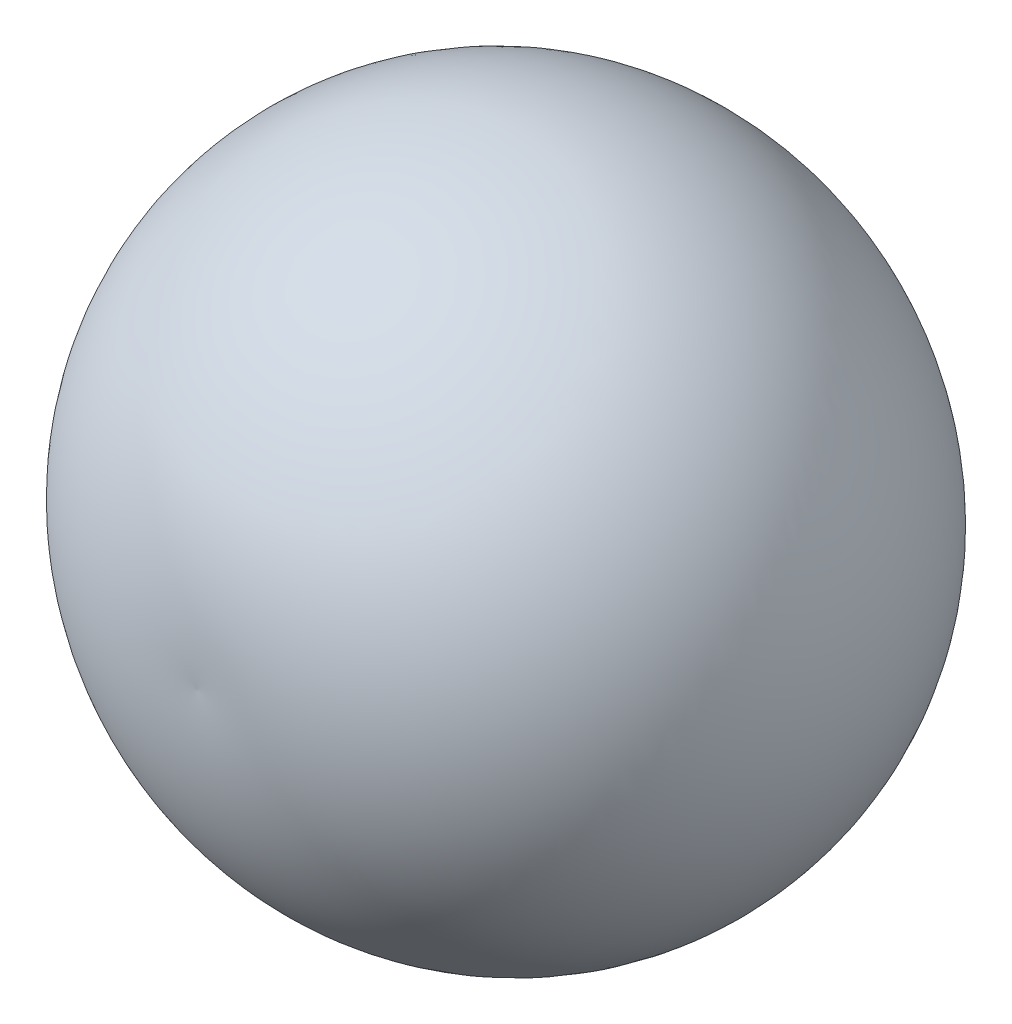
ISO-10303-21;
HEADER;
FILE_DESCRIPTION(('STEP AP214'),'2;1');
FILE_NAME('part.step','',(''),(''),'','','');
FILE_SCHEMA(('AUTOMOTIVE_DESIGN { 1 0 10303 214 1 1 1 1 }'));
ENDSEC;
DATA;
#1=APPLICATION_CONTEXT('core data for automotive mechanical design processes');
#2=APPLICATION_PROTOCOL_DEFINITION('international standard','automotive_design',2000,#1);
#3=PRODUCT_CONTEXT('',#1,'mechanical');
#4=PRODUCT('Part','Part','',(#3));
#5=PRODUCT_RELATED_PRODUCT_CATEGORY('part','',(#4));
#6=PRODUCT_DEFINITION_FORMATION('','',#4);
#7=PRODUCT_DEFINITION_CONTEXT('part definition',#1,'design');
#8=PRODUCT_DEFINITION('design','',#6,#7);
#9=PRODUCT_DEFINITION_SHAPE('','',#8);
#10=(LENGTH_UNIT() NAMED_UNIT(*) SI_UNIT(.MILLI.,.METRE.));
#11=(NAMED_UNIT(*) PLANE_ANGLE_UNIT() SI_UNIT($,.RADIAN.));
#12=(NAMED_UNIT(*) SI_UNIT($,.STERADIAN.) SOLID_ANGLE_UNIT());
#13=UNCERTAINTY_MEASURE_WITH_UNIT(LENGTH_MEASURE(1.E-05),#10,'distance_accuracy_value','');
#14=(GEOMETRIC_REPRESENTATION_CONTEXT(3) GLOBAL_UNCERTAINTY_ASSIGNED_CONTEXT((#13)) GLOBAL_UNIT_ASSIGNED_CONTEXT((#10,
#11,#12)) REPRESENTATION_CONTEXT('',''));
#15=CARTESIAN_POINT('',(0.,0.,0.));
#16=DIRECTION('',(0.,0.,1.));
#17=DIRECTION('',(1.,0.,0.));
#18=AXIS2_PLACEMENT_3D('',#15,#16,#17);
#19=CARTESIAN_POINT('',(-1.0872366157345,0.,0.));
#20=DIRECTION('',(0.,-1.,0.));
#21=DIRECTION('',(-1.,0.,0.));
#22=AXIS2_PLACEMENT_3D('',#19,#20,#21);
#23=CIRCLE('',#22,7.5);
#24=TRIMMED_CURVE('',#23,(PARAMETER_VALUE(-1.64334238524597)),
(PARAMETER_VALUE(1.64334238524597)),.T.,.PARAMETER.);
#25=CARTESIAN_POINT('',(-0.543618307867252,0.,0.));
#26=DIRECTION('',(0.,0.,-1.));
#27=AXIS1_PLACEMENT('',#25,#26);
#28=SURFACE_OF_REVOLUTION('',#24,#27);
#29=CARTESIAN_POINT('',(-0.543618307867252,0.,-7.48027266450572));
#30=VERTEX_POINT('',#29);
#31=VERTEX_LOOP('',#30);
#32=FACE_BOUND('',#31,.T.);
#33=CARTESIAN_POINT('',(-0.543618307867252,0.,7.48027266450572));
#34=VERTEX_POINT('',#33);
#35=VERTEX_LOOP('',#34);
#36=FACE_BOUND('',#35,.T.);
#37=ADVANCED_FACE('F35',(#32,#36),#28,.T.);
#38=CLOSED_SHELL('',(#37));
#39=MANIFOLD_SOLID_BREP('B2',#38);
#40=ADVANCED_BREP_SHAPE_REPRESENTATION('',(#18,#39),#14);
#41=SHAPE_DEFINITION_REPRESENTATION(#9,#40);
ENDSEC;
END-ISO-10303-21;
